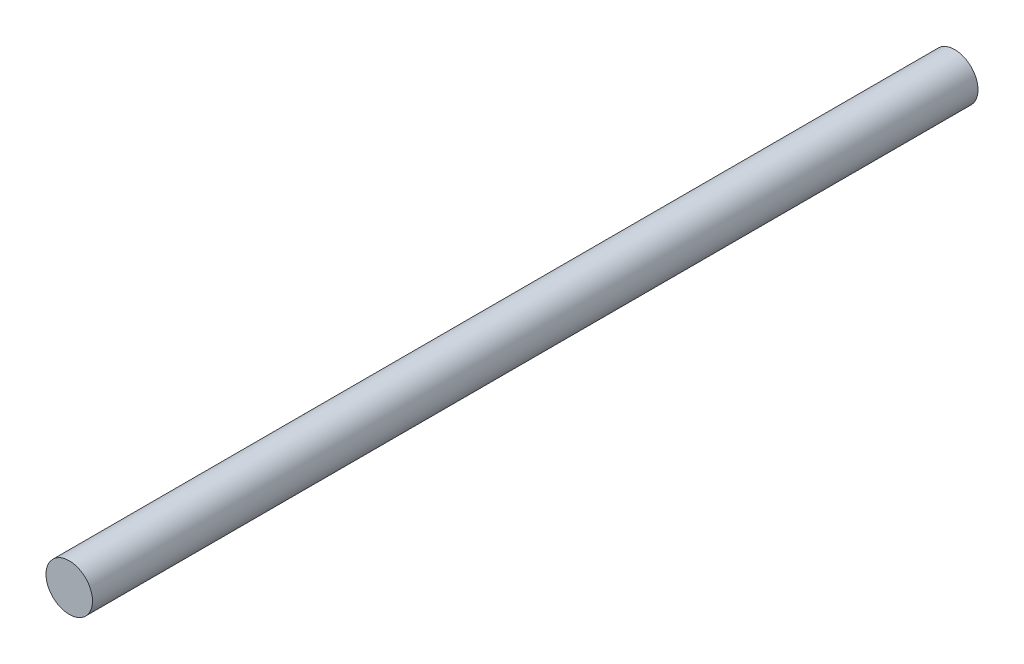
ISO-10303-21;
HEADER;
FILE_DESCRIPTION(('STEP AP214'),'2;1');
FILE_NAME('part.step','',(''),(''),'','','');
FILE_SCHEMA(('AUTOMOTIVE_DESIGN { 1 0 10303 214 1 1 1 1 }'));
ENDSEC;
DATA;
#1=APPLICATION_CONTEXT('core data for automotive mechanical design processes');
#2=APPLICATION_PROTOCOL_DEFINITION('international standard','automotive_design',2000,#1);
#3=PRODUCT_CONTEXT('',#1,'mechanical');
#4=PRODUCT('Part','Part','',(#3));
#5=PRODUCT_RELATED_PRODUCT_CATEGORY('part','',(#4));
#6=PRODUCT_DEFINITION_FORMATION('','',#4);
#7=PRODUCT_DEFINITION_CONTEXT('part definition',#1,'design');
#8=PRODUCT_DEFINITION('design','',#6,#7);
#9=PRODUCT_DEFINITION_SHAPE('','',#8);
#10=(LENGTH_UNIT() NAMED_UNIT(*) SI_UNIT(.MILLI.,.METRE.));
#11=(NAMED_UNIT(*) PLANE_ANGLE_UNIT() SI_UNIT($,.RADIAN.));
#12=(NAMED_UNIT(*) SI_UNIT($,.STERADIAN.) SOLID_ANGLE_UNIT());
#13=UNCERTAINTY_MEASURE_WITH_UNIT(LENGTH_MEASURE(1.E-05),#10,'distance_accuracy_value','');
#14=(GEOMETRIC_REPRESENTATION_CONTEXT(3) GLOBAL_UNCERTAINTY_ASSIGNED_CONTEXT((#13)) GLOBAL_UNIT_ASSIGNED_CONTEXT((#10,
#11,#12)) REPRESENTATION_CONTEXT('',''));
#15=CARTESIAN_POINT('',(0.,0.,0.));
#16=DIRECTION('',(0.,0.,1.));
#17=DIRECTION('',(1.,0.,0.));
#18=AXIS2_PLACEMENT_3D('',#15,#16,#17);
#19=CARTESIAN_POINT('',(0.,0.,399.298972696148));
#20=DIRECTION('',(0.,0.,-1.));
#21=DIRECTION('',(-1.,0.,0.));
#22=AXIS2_PLACEMENT_3D('',#19,#20,#21);
#23=CYLINDRICAL_SURFACE('',#22,18.25625);
#24=CARTESIAN_POINT('',(0.,0.,347.6625));
#25=DIRECTION('',(0.,0.,1.));
#26=DIRECTION('',(0.,-1.,0.));
#27=AXIS2_PLACEMENT_3D('',#24,#25,#26);
#28=CIRCLE('',#27,18.25625);
#29=CARTESIAN_POINT('',(0.,-18.25625,347.6625));
#30=VERTEX_POINT('',#29);
#31=EDGE_CURVE('E10',#30,#30,#28,.T.);
#32=ORIENTED_EDGE('',*,*,#31,.F.);
#33=EDGE_LOOP('',(#32));
#34=FACE_BOUND('',#33,.T.);
#35=CARTESIAN_POINT('',(0.,0.,-347.6625));
#36=DIRECTION('',(0.,0.,-1.));
#37=DIRECTION('',(0.,1.,0.));
#38=AXIS2_PLACEMENT_3D('',#35,#36,#37);
#39=CIRCLE('',#38,18.25625);
#40=CARTESIAN_POINT('',(0.,18.25625,-347.6625));
#41=VERTEX_POINT('',#40);
#42=EDGE_CURVE('E37',#41,#41,#39,.F.);
#43=ORIENTED_EDGE('',*,*,#42,.T.);
#44=EDGE_LOOP('',(#43));
#45=FACE_BOUND('',#44,.T.);
#46=ADVANCED_FACE('F30',(#34,#45),#23,.T.);
#47=CARTESIAN_POINT('',(-4.18751921079585E-13,0.,347.6625));
#48=DIRECTION('',(0.,0.,1.));
#49=DIRECTION('',(0.,-1.,0.));
#50=AXIS2_PLACEMENT_3D('',#47,#48,#49);
#51=PLANE('',#50);
#52=ORIENTED_EDGE('',*,*,#31,.T.);
#53=EDGE_LOOP('',(#52));
#54=FACE_BOUND('',#53,.T.);
#55=ADVANCED_FACE('F32',(#54),#51,.T.);
#56=CARTESIAN_POINT('',(-4.14881617280308E-13,2.13092283867659E-13,-347.6625));
#57=DIRECTION('',(0.,0.,-1.));
#58=DIRECTION('',(0.,1.,0.));
#59=AXIS2_PLACEMENT_3D('',#56,#57,#58);
#60=PLANE('',#59);
#61=ORIENTED_EDGE('',*,*,#42,.F.);
#62=EDGE_LOOP('',(#61));
#63=FACE_BOUND('',#62,.T.);
#64=ADVANCED_FACE('F44',(#63),#60,.T.);
#65=CLOSED_SHELL('',(#46,#55,#64));
#66=MANIFOLD_SOLID_BREP('B2',#65);
#67=ADVANCED_BREP_SHAPE_REPRESENTATION('',(#18,#66),#14);
#68=SHAPE_DEFINITION_REPRESENTATION(#9,#67);
ENDSEC;
END-ISO-10303-21;
